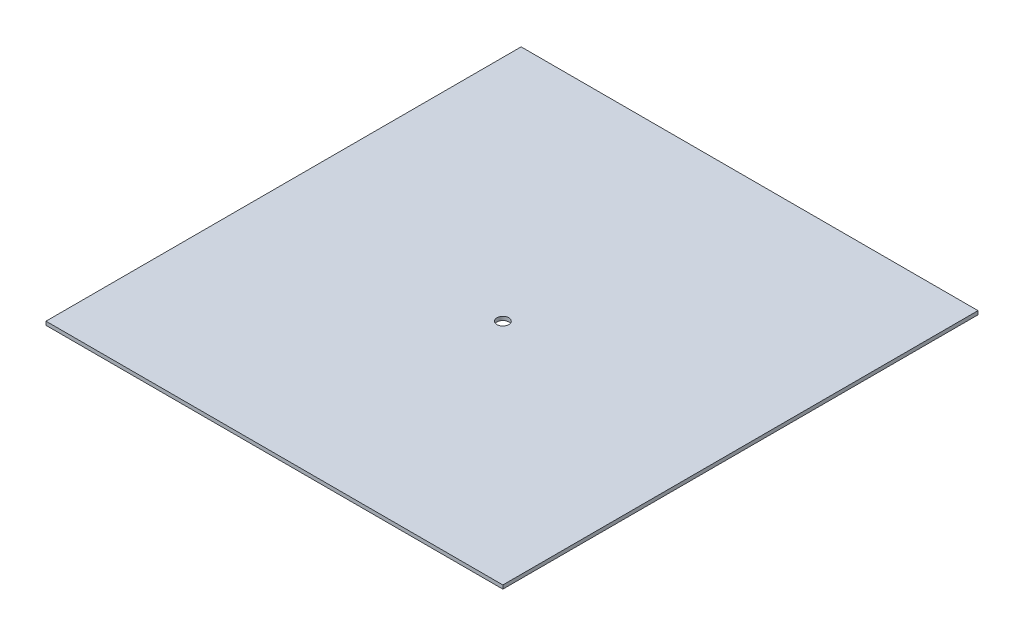
ISO-10303-21;
HEADER;
FILE_DESCRIPTION(('STEP AP214'),'2;1');
FILE_NAME('part.step','',(''),(''),'','','');
FILE_SCHEMA(('AUTOMOTIVE_DESIGN { 1 0 10303 214 1 1 1 1 }'));
ENDSEC;
DATA;
#1=APPLICATION_CONTEXT('core data for automotive mechanical design processes');
#2=APPLICATION_PROTOCOL_DEFINITION('international standard','automotive_design',2000,#1);
#3=PRODUCT_CONTEXT('',#1,'mechanical');
#4=PRODUCT('Part','Part','',(#3));
#5=PRODUCT_RELATED_PRODUCT_CATEGORY('part','',(#4));
#6=PRODUCT_DEFINITION_FORMATION('','',#4);
#7=PRODUCT_DEFINITION_CONTEXT('part definition',#1,'design');
#8=PRODUCT_DEFINITION('design','',#6,#7);
#9=PRODUCT_DEFINITION_SHAPE('','',#8);
#10=(LENGTH_UNIT() NAMED_UNIT(*) SI_UNIT(.MILLI.,.METRE.));
#11=(NAMED_UNIT(*) PLANE_ANGLE_UNIT() SI_UNIT($,.RADIAN.));
#12=(NAMED_UNIT(*) SI_UNIT($,.STERADIAN.) SOLID_ANGLE_UNIT());
#13=UNCERTAINTY_MEASURE_WITH_UNIT(LENGTH_MEASURE(1.E-05),#10,'distance_accuracy_value','');
#14=(GEOMETRIC_REPRESENTATION_CONTEXT(3) GLOBAL_UNCERTAINTY_ASSIGNED_CONTEXT((#13)) GLOBAL_UNIT_ASSIGNED_CONTEXT((#10,
#11,#12)) REPRESENTATION_CONTEXT('',''));
#15=CARTESIAN_POINT('',(0.,0.,0.));
#16=DIRECTION('',(0.,0.,1.));
#17=DIRECTION('',(1.,0.,0.));
#18=AXIS2_PLACEMENT_3D('',#15,#16,#17);
#19=CARTESIAN_POINT('',(0.,2.,0.));
#20=DIRECTION('',(0.,0.,-1.));
#21=DIRECTION('',(-1.,0.,0.));
#22=AXIS2_PLACEMENT_3D('',#19,#20,#21);
#23=PLANE('',#22);
#24=DIRECTION('',(1.,0.,0.));
#25=VECTOR('',#24,1.);
#26=CARTESIAN_POINT('',(0.,0.,0.));
#27=LINE('',#26,#25);
#28=CARTESIAN_POINT('',(0.,0.,0.));
#29=VERTEX_POINT('',#28);
#30=CARTESIAN_POINT('',(250.,0.,0.));
#31=VERTEX_POINT('',#30);
#32=EDGE_CURVE('E98',#29,#31,#27,.T.);
#33=ORIENTED_EDGE('',*,*,#32,.T.);
#34=DIRECTION('',(0.,-1.,0.));
#35=VECTOR('',#34,1.);
#36=CARTESIAN_POINT('',(250.,2.,0.));
#37=LINE('',#36,#35);
#38=CARTESIAN_POINT('',(250.,2.,0.));
#39=VERTEX_POINT('',#38);
#40=EDGE_CURVE('E11',#39,#31,#37,.T.);
#41=ORIENTED_EDGE('',*,*,#40,.F.);
#42=DIRECTION('',(1.,0.,0.));
#43=VECTOR('',#42,1.);
#44=CARTESIAN_POINT('',(0.,2.,0.));
#45=LINE('',#44,#43);
#46=CARTESIAN_POINT('',(0.,2.,0.));
#47=VERTEX_POINT('',#46);
#48=EDGE_CURVE('E85',#47,#39,#45,.T.);
#49=ORIENTED_EDGE('',*,*,#48,.F.);
#50=DIRECTION('',(0.,-1.,0.));
#51=VECTOR('',#50,1.);
#52=CARTESIAN_POINT('',(0.,2.,0.));
#53=LINE('',#52,#51);
#54=EDGE_CURVE('E94',#47,#29,#53,.T.);
#55=ORIENTED_EDGE('',*,*,#54,.T.);
#56=EDGE_LOOP('',(#33,#41,#49,#55));
#57=FACE_BOUND('',#56,.T.);
#58=ADVANCED_FACE('F33',(#57),#23,.F.);
#59=CARTESIAN_POINT('',(250.,2.,0.));
#60=DIRECTION('',(-1.,0.,0.));
#61=DIRECTION('',(0.,0.,1.));
#62=AXIS2_PLACEMENT_3D('',#59,#60,#61);
#63=PLANE('',#62);
#64=DIRECTION('',(0.,0.,-1.));
#65=VECTOR('',#64,1.);
#66=CARTESIAN_POINT('',(250.,0.,0.));
#67=LINE('',#66,#65);
#68=CARTESIAN_POINT('',(250.,0.,-260.));
#69=VERTEX_POINT('',#68);
#70=EDGE_CURVE('E89',#31,#69,#67,.T.);
#71=ORIENTED_EDGE('',*,*,#70,.T.);
#72=DIRECTION('',(0.,-1.,0.));
#73=VECTOR('',#72,1.);
#74=CARTESIAN_POINT('',(250.,2.,-260.));
#75=LINE('',#74,#73);
#76=CARTESIAN_POINT('',(250.,2.,-260.));
#77=VERTEX_POINT('',#76);
#78=EDGE_CURVE('E42',#77,#69,#75,.T.);
#79=ORIENTED_EDGE('',*,*,#78,.F.);
#80=DIRECTION('',(0.,0.,-1.));
#81=VECTOR('',#80,1.);
#82=CARTESIAN_POINT('',(250.,2.,0.));
#83=LINE('',#82,#81);
#84=EDGE_CURVE('E80',#39,#77,#83,.T.);
#85=ORIENTED_EDGE('',*,*,#84,.F.);
#86=ORIENTED_EDGE('',*,*,#40,.T.);
#87=EDGE_LOOP('',(#71,#79,#85,#86));
#88=FACE_BOUND('',#87,.T.);
#89=ADVANCED_FACE('F88',(#88),#63,.F.);
#90=CARTESIAN_POINT('',(0.,2.,-260.));
#91=DIRECTION('',(0.,0.,1.));
#92=DIRECTION('',(1.,0.,0.));
#93=AXIS2_PLACEMENT_3D('',#90,#91,#92);
#94=PLANE('',#93);
#95=DIRECTION('',(-1.,0.,0.));
#96=VECTOR('',#95,1.);
#97=CARTESIAN_POINT('',(0.,0.,-260.));
#98=LINE('',#97,#96);
#99=CARTESIAN_POINT('',(0.,0.,-260.));
#100=VERTEX_POINT('',#99);
#101=EDGE_CURVE('E67',#69,#100,#98,.T.);
#102=ORIENTED_EDGE('',*,*,#101,.T.);
#103=DIRECTION('',(0.,-1.,0.));
#104=VECTOR('',#103,1.);
#105=CARTESIAN_POINT('',(0.,2.,-260.));
#106=LINE('',#105,#104);
#107=CARTESIAN_POINT('',(0.,2.,-260.));
#108=VERTEX_POINT('',#107);
#109=EDGE_CURVE('E90',#108,#100,#106,.T.);
#110=ORIENTED_EDGE('',*,*,#109,.F.);
#111=DIRECTION('',(-1.,0.,0.));
#112=VECTOR('',#111,1.);
#113=CARTESIAN_POINT('',(0.,2.,-260.));
#114=LINE('',#113,#112);
#115=EDGE_CURVE('E83',#77,#108,#114,.T.);
#116=ORIENTED_EDGE('',*,*,#115,.F.);
#117=ORIENTED_EDGE('',*,*,#78,.T.);
#118=EDGE_LOOP('',(#102,#110,#116,#117));
#119=FACE_BOUND('',#118,.T.);
#120=ADVANCED_FACE('F92',(#119),#94,.F.);
#121=CARTESIAN_POINT('',(0.,2.,0.));
#122=DIRECTION('',(1.,0.,0.));
#123=DIRECTION('',(0.,0.,-1.));
#124=AXIS2_PLACEMENT_3D('',#121,#122,#123);
#125=PLANE('',#124);
#126=DIRECTION('',(0.,0.,1.));
#127=VECTOR('',#126,1.);
#128=CARTESIAN_POINT('',(0.,0.,0.));
#129=LINE('',#128,#127);
#130=EDGE_CURVE('E73',#100,#29,#129,.T.);
#131=ORIENTED_EDGE('',*,*,#130,.T.);
#132=ORIENTED_EDGE('',*,*,#54,.F.);
#133=DIRECTION('',(0.,0.,1.));
#134=VECTOR('',#133,1.);
#135=CARTESIAN_POINT('',(0.,2.,0.));
#136=LINE('',#135,#134);
#137=EDGE_CURVE('E50',#108,#47,#136,.T.);
#138=ORIENTED_EDGE('',*,*,#137,.F.);
#139=ORIENTED_EDGE('',*,*,#109,.T.);
#140=EDGE_LOOP('',(#131,#132,#138,#139));
#141=FACE_BOUND('',#140,.T.);
#142=ADVANCED_FACE('F105',(#141),#125,.F.);
#143=CARTESIAN_POINT('',(250.,2.,0.));
#144=DIRECTION('',(0.,1.,0.));
#145=DIRECTION('',(0.,0.,1.));
#146=AXIS2_PLACEMENT_3D('',#143,#144,#145);
#147=PLANE('',#146);
#148=CARTESIAN_POINT('',(125.,2.,-125.));
#149=DIRECTION('',(0.,1.,0.));
#150=DIRECTION('',(0.,0.,1.));
#151=AXIS2_PLACEMENT_3D('',#148,#149,#150);
#152=CIRCLE('',#151,3.25);
#153=CARTESIAN_POINT('',(125.,2.,-121.75));
#154=VERTEX_POINT('',#153);
#155=EDGE_CURVE('E111',#154,#154,#152,.T.);
#156=ORIENTED_EDGE('',*,*,#155,.F.);
#157=EDGE_LOOP('',(#156));
#158=FACE_BOUND('',#157,.T.);
#159=ORIENTED_EDGE('',*,*,#48,.T.);
#160=ORIENTED_EDGE('',*,*,#84,.T.);
#161=ORIENTED_EDGE('',*,*,#115,.T.);
#162=ORIENTED_EDGE('',*,*,#137,.T.);
#163=EDGE_LOOP('',(#159,#160,#161,#162));
#164=FACE_BOUND('',#163,.T.);
#165=ADVANCED_FACE('F81',(#158,#164),#147,.T.);
#166=CARTESIAN_POINT('',(250.,0.,0.));
#167=DIRECTION('',(0.,1.,0.));
#168=DIRECTION('',(0.,0.,1.));
#169=AXIS2_PLACEMENT_3D('',#166,#167,#168);
#170=PLANE('',#169);
#171=CARTESIAN_POINT('',(125.,0.,-125.));
#172=DIRECTION('',(0.,1.,0.));
#173=DIRECTION('',(0.,0.,1.));
#174=AXIS2_PLACEMENT_3D('',#171,#172,#173);
#175=CIRCLE('',#174,3.25);
#176=CARTESIAN_POINT('',(125.,0.,-121.75));
#177=VERTEX_POINT('',#176);
#178=EDGE_CURVE('E36',#177,#177,#175,.T.);
#179=ORIENTED_EDGE('',*,*,#178,.T.);
#180=EDGE_LOOP('',(#179));
#181=FACE_BOUND('',#180,.T.);
#182=ORIENTED_EDGE('',*,*,#32,.F.);
#183=ORIENTED_EDGE('',*,*,#130,.F.);
#184=ORIENTED_EDGE('',*,*,#101,.F.);
#185=ORIENTED_EDGE('',*,*,#70,.F.);
#186=EDGE_LOOP('',(#182,#183,#184,#185));
#187=FACE_BOUND('',#186,.T.);
#188=ADVANCED_FACE('F108',(#181,#187),#170,.F.);
#189=CARTESIAN_POINT('',(125.,2.,-125.));
#190=DIRECTION('',(0.,1.,0.));
#191=DIRECTION('',(0.,0.,1.));
#192=AXIS2_PLACEMENT_3D('',#189,#190,#191);
#193=CYLINDRICAL_SURFACE('',#192,3.25);
#194=ORIENTED_EDGE('',*,*,#155,.T.);
#195=EDGE_LOOP('',(#194));
#196=FACE_BOUND('',#195,.T.);
#197=ORIENTED_EDGE('',*,*,#178,.F.);
#198=EDGE_LOOP('',(#197));
#199=FACE_BOUND('',#198,.T.);
#200=ADVANCED_FACE('F119',(#196,#199),#193,.F.);
#201=CLOSED_SHELL('',(#58,#89,#120,#142,#165,#188,#200));
#202=MANIFOLD_SOLID_BREP('B2',#201);
#203=ADVANCED_BREP_SHAPE_REPRESENTATION('',(#18,#202),#14);
#204=SHAPE_DEFINITION_REPRESENTATION(#9,#203);
ENDSEC;
END-ISO-10303-21;
